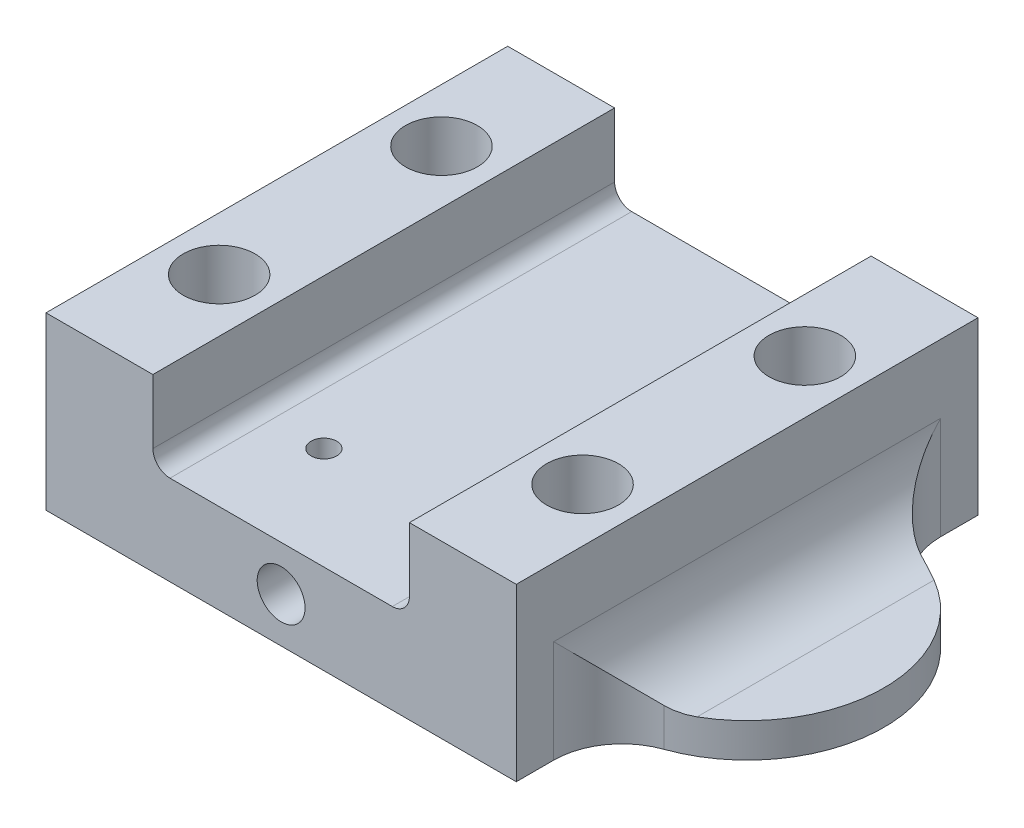
ISO-10303-21;
HEADER;
FILE_DESCRIPTION(('STEP AP214'),'2;1');
FILE_NAME('part.step','',(''),(''),'','','');
FILE_SCHEMA(('AUTOMOTIVE_DESIGN { 1 0 10303 214 1 1 1 1 }'));
ENDSEC;
DATA;
#1=APPLICATION_CONTEXT('core data for automotive mechanical design processes');
#2=APPLICATION_PROTOCOL_DEFINITION('international standard','automotive_design',2000,#1);
#3=PRODUCT_CONTEXT('',#1,'mechanical');
#4=PRODUCT('Part','Part','',(#3));
#5=PRODUCT_RELATED_PRODUCT_CATEGORY('part','',(#4));
#6=PRODUCT_DEFINITION_FORMATION('','',#4);
#7=PRODUCT_DEFINITION_CONTEXT('part definition',#1,'design');
#8=PRODUCT_DEFINITION('design','',#6,#7);
#9=PRODUCT_DEFINITION_SHAPE('','',#8);
#10=(LENGTH_UNIT() NAMED_UNIT(*) SI_UNIT(.MILLI.,.METRE.));
#11=(NAMED_UNIT(*) PLANE_ANGLE_UNIT() SI_UNIT($,.RADIAN.));
#12=(NAMED_UNIT(*) SI_UNIT($,.STERADIAN.) SOLID_ANGLE_UNIT());
#13=UNCERTAINTY_MEASURE_WITH_UNIT(LENGTH_MEASURE(1.E-05),#10,'distance_accuracy_value','');
#14=(GEOMETRIC_REPRESENTATION_CONTEXT(3) GLOBAL_UNCERTAINTY_ASSIGNED_CONTEXT((#13)) GLOBAL_UNIT_ASSIGNED_CONTEXT((#10,
#11,#12)) REPRESENTATION_CONTEXT('',''));
#15=CARTESIAN_POINT('',(0.,0.,0.));
#16=DIRECTION('',(0.,0.,1.));
#17=DIRECTION('',(1.,0.,0.));
#18=AXIS2_PLACEMENT_3D('',#15,#16,#17);
#19=CARTESIAN_POINT('',(0.,-10.,27.));
#20=DIRECTION('',(0.,1.,0.));
#21=DIRECTION('',(0.,0.,1.));
#22=AXIS2_PLACEMENT_3D('',#19,#20,#21);
#23=PLANE('',#22);
#24=CARTESIAN_POINT('',(-3.50000000000001,-10.,21.));
#25=DIRECTION('',(0.,1.,0.));
#26=DIRECTION('',(-1.,0.,0.));
#27=AXIS2_PLACEMENT_3D('',#24,#25,#26);
#28=CIRCLE('',#27,0.750000000000001);
#29=CARTESIAN_POINT('',(-4.25000000000001,-10.,21.));
#30=VERTEX_POINT('',#29);
#31=EDGE_CURVE('E389',#30,#30,#28,.T.);
#32=ORIENTED_EDGE('',*,*,#31,.T.);
#33=EDGE_LOOP('',(#32));
#34=FACE_BOUND('',#33,.T.);
#35=CARTESIAN_POINT('',(3.49999999999999,-10.,6.));
#36=DIRECTION('',(0.,1.,0.));
#37=DIRECTION('',(-1.,0.,0.));
#38=AXIS2_PLACEMENT_3D('',#35,#36,#37);
#39=CIRCLE('',#38,0.749999999999999);
#40=CARTESIAN_POINT('',(2.74999999999999,-10.,6.));
#41=VERTEX_POINT('',#40);
#42=EDGE_CURVE('E405',#41,#41,#39,.T.);
#43=ORIENTED_EDGE('',*,*,#42,.T.);
#44=EDGE_LOOP('',(#43));
#45=FACE_BOUND('',#44,.T.);
#46=CARTESIAN_POINT('',(10.625,-10.,7.));
#47=DIRECTION('',(0.,1.,0.));
#48=DIRECTION('',(0.,0.,1.));
#49=AXIS2_PLACEMENT_3D('',#46,#47,#48);
#50=CIRCLE('',#49,2.1);
#51=CARTESIAN_POINT('',(10.625,-10.,9.1));
#52=VERTEX_POINT('',#51);
#53=EDGE_CURVE('E417',#52,#52,#50,.T.);
#54=ORIENTED_EDGE('',*,*,#53,.T.);
#55=EDGE_LOOP('',(#54));
#56=FACE_BOUND('',#55,.T.);
#57=CARTESIAN_POINT('',(-10.625,-10.,20.));
#58=DIRECTION('',(0.,1.,0.));
#59=DIRECTION('',(0.,0.,1.));
#60=AXIS2_PLACEMENT_3D('',#57,#58,#59);
#61=CIRCLE('',#60,2.1);
#62=CARTESIAN_POINT('',(-10.625,-10.,22.1));
#63=VERTEX_POINT('',#62);
#64=EDGE_CURVE('E441',#63,#63,#61,.T.);
#65=ORIENTED_EDGE('',*,*,#64,.T.);
#66=EDGE_LOOP('',(#65));
#67=FACE_BOUND('',#66,.T.);
#68=DIRECTION('',(1.,0.,0.));
#69=VECTOR('',#68,1.);
#70=CARTESIAN_POINT('',(0.,-10.,0.));
#71=LINE('',#70,#69);
#72=CARTESIAN_POINT('',(-13.75,-10.,0.));
#73=VERTEX_POINT('',#72);
#74=CARTESIAN_POINT('',(13.75,-10.,0.));
#75=VERTEX_POINT('',#74);
#76=EDGE_CURVE('E461',#73,#75,#71,.T.);
#77=ORIENTED_EDGE('',*,*,#76,.T.);
#78=DIRECTION('',(0.,0.,-1.));
#79=VECTOR('',#78,1.);
#80=CARTESIAN_POINT('',(13.75,-10.,27.));
#81=LINE('',#80,#79);
#82=CARTESIAN_POINT('',(13.75,-10.,2.18629150101524));
#83=VERTEX_POINT('',#82);
#84=EDGE_CURVE('E221',#83,#75,#81,.T.);
#85=ORIENTED_EDGE('',*,*,#84,.F.);
#86=CARTESIAN_POINT('',(17.75,-10.,2.18629150101524));
#87=DIRECTION('',(0.,1.,0.));
#88=DIRECTION('',(0.,0.,1.));
#89=AXIS2_PLACEMENT_3D('',#86,#87,#88);
#90=CIRCLE('',#89,4.);
#91=CARTESIAN_POINT('',(16.4166666666667,-10.,5.95752766734349));
#92=VERTEX_POINT('',#91);
#93=EDGE_CURVE('E287',#83,#92,#90,.T.);
#94=ORIENTED_EDGE('',*,*,#93,.T.);
#95=CARTESIAN_POINT('',(13.75,-10.,13.5));
#96=DIRECTION('',(0.,-1.,0.));
#97=DIRECTION('',(0.,0.,-1.));
#98=AXIS2_PLACEMENT_3D('',#95,#96,#97);
#99=CIRCLE('',#98,8.);
#100=CARTESIAN_POINT('',(16.4166666666667,-10.,21.0424723326565));
#101=VERTEX_POINT('',#100);
#102=EDGE_CURVE('E453',#92,#101,#99,.T.);
#103=ORIENTED_EDGE('',*,*,#102,.T.);
#104=CARTESIAN_POINT('',(17.75,-10.,24.8137084989848));
#105=DIRECTION('',(0.,1.,0.));
#106=DIRECTION('',(0.,0.,1.));
#107=AXIS2_PLACEMENT_3D('',#104,#105,#106);
#108=CIRCLE('',#107,4.);
#109=CARTESIAN_POINT('',(13.75,-10.,24.8137084989848));
#110=VERTEX_POINT('',#109);
#111=EDGE_CURVE('E218',#101,#110,#108,.T.);
#112=ORIENTED_EDGE('',*,*,#111,.T.);
#113=CARTESIAN_POINT('',(13.75,-10.,27.));
#114=VERTEX_POINT('',#113);
#115=EDGE_CURVE('E192',#114,#110,#81,.T.);
#116=ORIENTED_EDGE('',*,*,#115,.F.);
#117=DIRECTION('',(1.,0.,0.));
#118=VECTOR('',#117,1.);
#119=CARTESIAN_POINT('',(0.,-10.,27.));
#120=LINE('',#119,#118);
#121=CARTESIAN_POINT('',(-13.75,-10.,27.));
#122=VERTEX_POINT('',#121);
#123=EDGE_CURVE('E201',#122,#114,#120,.T.);
#124=ORIENTED_EDGE('',*,*,#123,.F.);
#125=DIRECTION('',(0.,0.,-1.));
#126=VECTOR('',#125,1.);
#127=CARTESIAN_POINT('',(-13.75,-10.,27.));
#128=LINE('',#127,#126);
#129=CARTESIAN_POINT('',(-13.75,-10.,24.8137084989848));
#130=VERTEX_POINT('',#129);
#131=EDGE_CURVE('E503',#122,#130,#128,.T.);
#132=ORIENTED_EDGE('',*,*,#131,.T.);
#133=CARTESIAN_POINT('',(-17.75,-10.,24.8137084989848));
#134=DIRECTION('',(0.,1.,0.));
#135=DIRECTION('',(0.,0.,1.));
#136=AXIS2_PLACEMENT_3D('',#133,#134,#135);
#137=CIRCLE('',#136,4.);
#138=CARTESIAN_POINT('',(-16.4166666666667,-10.,21.0424723326565));
#139=VERTEX_POINT('',#138);
#140=EDGE_CURVE('E12',#130,#139,#137,.T.);
#141=ORIENTED_EDGE('',*,*,#140,.T.);
#142=CARTESIAN_POINT('',(-13.75,-10.,13.5));
#143=DIRECTION('',(0.,-1.,0.));
#144=DIRECTION('',(0.,0.,1.));
#145=AXIS2_PLACEMENT_3D('',#142,#143,#144);
#146=CIRCLE('',#145,8.00000000000001);
#147=CARTESIAN_POINT('',(-16.4166666666667,-10.,5.95752766734349));
#148=VERTEX_POINT('',#147);
#149=EDGE_CURVE('E445',#139,#148,#146,.T.);
#150=ORIENTED_EDGE('',*,*,#149,.T.);
#151=CARTESIAN_POINT('',(-17.75,-10.,2.18629150101523));
#152=DIRECTION('',(0.,1.,0.));
#153=DIRECTION('',(0.,0.,1.));
#154=AXIS2_PLACEMENT_3D('',#151,#152,#153);
#155=CIRCLE('',#154,4.);
#156=CARTESIAN_POINT('',(-13.75,-10.,2.18629150101523));
#157=VERTEX_POINT('',#156);
#158=EDGE_CURVE('E557',#148,#157,#155,.T.);
#159=ORIENTED_EDGE('',*,*,#158,.T.);
#160=EDGE_CURVE('E479',#157,#73,#128,.T.);
#161=ORIENTED_EDGE('',*,*,#160,.T.);
#162=EDGE_LOOP('',(#77,#85,#94,#103,#112,#116,#124,#132,#141,#150,#159,#161));
#163=FACE_BOUND('',#162,.T.);
#164=CARTESIAN_POINT('',(-10.625,-10.,7.));
#165=DIRECTION('',(0.,1.,0.));
#166=DIRECTION('',(0.,0.,1.));
#167=AXIS2_PLACEMENT_3D('',#164,#165,#166);
#168=CIRCLE('',#167,2.1);
#169=CARTESIAN_POINT('',(-10.625,-10.,9.1));
#170=VERTEX_POINT('',#169);
#171=EDGE_CURVE('E434',#170,#170,#168,.F.);
#172=ORIENTED_EDGE('',*,*,#171,.F.);
#173=EDGE_LOOP('',(#172));
#174=FACE_BOUND('',#173,.T.);
#175=CARTESIAN_POINT('',(10.625,-10.,20.));
#176=DIRECTION('',(0.,1.,0.));
#177=DIRECTION('',(0.,0.,1.));
#178=AXIS2_PLACEMENT_3D('',#175,#176,#177);
#179=CIRCLE('',#178,2.1);
#180=CARTESIAN_POINT('',(10.625,-10.,22.1));
#181=VERTEX_POINT('',#180);
#182=EDGE_CURVE('E425',#181,#181,#179,.F.);
#183=ORIENTED_EDGE('',*,*,#182,.F.);
#184=EDGE_LOOP('',(#183));
#185=FACE_BOUND('',#184,.T.);
#186=ADVANCED_FACE('F47',(#34,#45,#56,#67,#163,#174,#185),#23,.F.);
#187=CARTESIAN_POINT('',(0.,0.,27.));
#188=DIRECTION('',(0.,1.,0.));
#189=DIRECTION('',(0.,0.,1.));
#190=AXIS2_PLACEMENT_3D('',#187,#188,#189);
#191=PLANE('',#190);
#192=DIRECTION('',(1.,0.,0.));
#193=VECTOR('',#192,1.);
#194=CARTESIAN_POINT('',(0.,0.,0.));
#195=LINE('',#194,#193);
#196=CARTESIAN_POINT('',(7.5,0.,0.));
#197=VERTEX_POINT('',#196);
#198=CARTESIAN_POINT('',(13.75,0.,0.));
#199=VERTEX_POINT('',#198);
#200=EDGE_CURVE('E485',#197,#199,#195,.T.);
#201=ORIENTED_EDGE('',*,*,#200,.F.);
#202=DIRECTION('',(0.,0.,-1.));
#203=VECTOR('',#202,1.);
#204=CARTESIAN_POINT('',(7.5,0.,27.));
#205=LINE('',#204,#203);
#206=CARTESIAN_POINT('',(7.5,0.,27.));
#207=VERTEX_POINT('',#206);
#208=EDGE_CURVE('E512',#207,#197,#205,.T.);
#209=ORIENTED_EDGE('',*,*,#208,.F.);
#210=DIRECTION('',(1.,0.,0.));
#211=VECTOR('',#210,1.);
#212=CARTESIAN_POINT('',(0.,0.,27.));
#213=LINE('',#212,#211);
#214=CARTESIAN_POINT('',(13.75,0.,27.));
#215=VERTEX_POINT('',#214);
#216=EDGE_CURVE('E200',#207,#215,#213,.T.);
#217=ORIENTED_EDGE('',*,*,#216,.T.);
#218=DIRECTION('',(0.,0.,-1.));
#219=VECTOR('',#218,1.);
#220=CARTESIAN_POINT('',(13.75,0.,27.));
#221=LINE('',#220,#219);
#222=EDGE_CURVE('E195',#215,#199,#221,.T.);
#223=ORIENTED_EDGE('',*,*,#222,.T.);
#224=EDGE_LOOP('',(#201,#209,#217,#223));
#225=FACE_BOUND('',#224,.T.);
#226=CARTESIAN_POINT('',(10.625,0.,7.));
#227=DIRECTION('',(0.,1.,0.));
#228=DIRECTION('',(0.,0.,1.));
#229=AXIS2_PLACEMENT_3D('',#226,#227,#228);
#230=CIRCLE('',#229,2.1);
#231=CARTESIAN_POINT('',(10.625,0.,9.1));
#232=VERTEX_POINT('',#231);
#233=EDGE_CURVE('E413',#232,#232,#230,.T.);
#234=ORIENTED_EDGE('',*,*,#233,.F.);
#235=EDGE_LOOP('',(#234));
#236=FACE_BOUND('',#235,.T.);
#237=CARTESIAN_POINT('',(10.625,0.,20.));
#238=DIRECTION('',(0.,1.,0.));
#239=DIRECTION('',(0.,0.,1.));
#240=AXIS2_PLACEMENT_3D('',#237,#238,#239);
#241=CIRCLE('',#240,2.1);
#242=CARTESIAN_POINT('',(10.625,0.,22.1));
#243=VERTEX_POINT('',#242);
#244=EDGE_CURVE('E430',#243,#243,#241,.F.);
#245=ORIENTED_EDGE('',*,*,#244,.T.);
#246=EDGE_LOOP('',(#245));
#247=FACE_BOUND('',#246,.T.);
#248=ADVANCED_FACE('F330',(#225,#236,#247),#191,.T.);
#249=CARTESIAN_POINT('',(-13.75,0.,0.));
#250=VERTEX_POINT('',#249);
#251=CARTESIAN_POINT('',(-7.5,0.,0.));
#252=VERTEX_POINT('',#251);
#253=EDGE_CURVE('E490',#250,#252,#195,.T.);
#254=ORIENTED_EDGE('',*,*,#253,.F.);
#255=DIRECTION('',(0.,0.,-1.));
#256=VECTOR('',#255,1.);
#257=CARTESIAN_POINT('',(-13.75,0.,27.));
#258=LINE('',#257,#256);
#259=CARTESIAN_POINT('',(-13.75,0.,27.));
#260=VERTEX_POINT('',#259);
#261=EDGE_CURVE('E506',#260,#250,#258,.T.);
#262=ORIENTED_EDGE('',*,*,#261,.F.);
#263=CARTESIAN_POINT('',(-7.5,0.,27.));
#264=VERTEX_POINT('',#263);
#265=EDGE_CURVE('E467',#260,#264,#213,.T.);
#266=ORIENTED_EDGE('',*,*,#265,.T.);
#267=DIRECTION('',(0.,0.,-1.));
#268=VECTOR('',#267,1.);
#269=CARTESIAN_POINT('',(-7.5,0.,27.));
#270=LINE('',#269,#268);
#271=EDGE_CURVE('E509',#264,#252,#270,.T.);
#272=ORIENTED_EDGE('',*,*,#271,.T.);
#273=EDGE_LOOP('',(#254,#262,#266,#272));
#274=FACE_BOUND('',#273,.T.);
#275=CARTESIAN_POINT('',(-10.625,0.,20.));
#276=DIRECTION('',(0.,1.,0.));
#277=DIRECTION('',(0.,0.,1.));
#278=AXIS2_PLACEMENT_3D('',#275,#276,#277);
#279=CIRCLE('',#278,2.1);
#280=CARTESIAN_POINT('',(-10.625,0.,22.1));
#281=VERTEX_POINT('',#280);
#282=EDGE_CURVE('E429',#281,#281,#279,.T.);
#283=ORIENTED_EDGE('',*,*,#282,.F.);
#284=EDGE_LOOP('',(#283));
#285=FACE_BOUND('',#284,.T.);
#286=CARTESIAN_POINT('',(-10.625,0.,7.));
#287=DIRECTION('',(0.,1.,0.));
#288=DIRECTION('',(0.,0.,1.));
#289=AXIS2_PLACEMENT_3D('',#286,#287,#288);
#290=CIRCLE('',#289,2.1);
#291=CARTESIAN_POINT('',(-10.625,0.,9.1));
#292=VERTEX_POINT('',#291);
#293=EDGE_CURVE('E421',#292,#292,#290,.F.);
#294=ORIENTED_EDGE('',*,*,#293,.T.);
#295=EDGE_LOOP('',(#294));
#296=FACE_BOUND('',#295,.T.);
#297=ADVANCED_FACE('F333',(#274,#285,#296),#191,.T.);
#298=CARTESIAN_POINT('',(13.75,0.,27.));
#299=DIRECTION('',(-1.,0.,0.));
#300=DIRECTION('',(0.,0.,1.));
#301=AXIS2_PLACEMENT_3D('',#298,#299,#300);
#302=PLANE('',#301);
#303=DIRECTION('',(0.,0.,-1.));
#304=VECTOR('',#303,1.);
#305=CARTESIAN_POINT('',(13.75,-4.,5.5));
#306=LINE('',#305,#304);
#307=CARTESIAN_POINT('',(13.75,-4.,24.8137084989848));
#308=VERTEX_POINT('',#307);
#309=CARTESIAN_POINT('',(13.75,-4.,2.18629150101524));
#310=VERTEX_POINT('',#309);
#311=EDGE_CURVE('E255',#308,#310,#306,.T.);
#312=ORIENTED_EDGE('',*,*,#311,.T.);
#313=DIRECTION('',(0.,-1.,0.));
#314=VECTOR('',#313,1.);
#315=CARTESIAN_POINT('',(13.75,0.,2.18629150101524));
#316=LINE('',#315,#314);
#317=EDGE_CURVE('E258',#310,#83,#316,.T.);
#318=ORIENTED_EDGE('',*,*,#317,.T.);
#319=ORIENTED_EDGE('',*,*,#84,.T.);
#320=DIRECTION('',(0.,1.,0.));
#321=VECTOR('',#320,1.);
#322=CARTESIAN_POINT('',(13.75,0.,0.));
#323=LINE('',#322,#321);
#324=EDGE_CURVE('E482',#75,#199,#323,.T.);
#325=ORIENTED_EDGE('',*,*,#324,.T.);
#326=ORIENTED_EDGE('',*,*,#222,.F.);
#327=DIRECTION('',(0.,1.,0.));
#328=VECTOR('',#327,1.);
#329=CARTESIAN_POINT('',(13.75,0.,27.));
#330=LINE('',#329,#328);
#331=EDGE_CURVE('E188',#114,#215,#330,.T.);
#332=ORIENTED_EDGE('',*,*,#331,.F.);
#333=ORIENTED_EDGE('',*,*,#115,.T.);
#334=DIRECTION('',(0.,-1.,0.));
#335=VECTOR('',#334,1.);
#336=CARTESIAN_POINT('',(13.75,0.,24.8137084989848));
#337=LINE('',#336,#335);
#338=EDGE_CURVE('E252',#110,#308,#337,.F.);
#339=ORIENTED_EDGE('',*,*,#338,.T.);
#340=EDGE_LOOP('',(#312,#318,#319,#325,#326,#332,#333,#339));
#341=FACE_BOUND('',#340,.T.);
#342=ADVANCED_FACE('F190',(#341),#302,.F.);
#343=CARTESIAN_POINT('',(7.5,0.,27.));
#344=DIRECTION('',(-1.,0.,0.));
#345=DIRECTION('',(0.,-1.,0.));
#346=AXIS2_PLACEMENT_3D('',#343,#344,#345);
#347=PLANE('',#346);
#348=DIRECTION('',(0.,1.,0.));
#349=VECTOR('',#348,1.);
#350=CARTESIAN_POINT('',(7.5,0.,0.));
#351=LINE('',#350,#349);
#352=CARTESIAN_POINT('',(7.5,-3.75,0.));
#353=VERTEX_POINT('',#352);
#354=EDGE_CURVE('E489',#353,#197,#351,.T.);
#355=ORIENTED_EDGE('',*,*,#354,.F.);
#356=DIRECTION('',(0.,0.,-1.));
#357=VECTOR('',#356,1.);
#358=CARTESIAN_POINT('',(7.5,-3.75,27.));
#359=LINE('',#358,#357);
#360=CARTESIAN_POINT('',(7.5,-3.75,27.));
#361=VERTEX_POINT('',#360);
#362=EDGE_CURVE('E233',#353,#361,#359,.F.);
#363=ORIENTED_EDGE('',*,*,#362,.T.);
#364=DIRECTION('',(0.,1.,0.));
#365=VECTOR('',#364,1.);
#366=CARTESIAN_POINT('',(7.5,0.,27.));
#367=LINE('',#366,#365);
#368=EDGE_CURVE('E466',#361,#207,#367,.T.);
#369=ORIENTED_EDGE('',*,*,#368,.T.);
#370=ORIENTED_EDGE('',*,*,#208,.T.);
#371=EDGE_LOOP('',(#355,#363,#369,#370));
#372=FACE_BOUND('',#371,.T.);
#373=ADVANCED_FACE('F341',(#372),#347,.T.);
#374=CARTESIAN_POINT('',(0.,-4.75,27.));
#375=DIRECTION('',(0.,1.,0.));
#376=DIRECTION('',(-1.,0.,0.));
#377=AXIS2_PLACEMENT_3D('',#374,#375,#376);
#378=PLANE('',#377);
#379=CARTESIAN_POINT('',(-3.5,-4.75,21.));
#380=DIRECTION('',(0.,1.,0.));
#381=DIRECTION('',(-1.,0.,0.));
#382=AXIS2_PLACEMENT_3D('',#379,#380,#381);
#383=CIRCLE('',#382,0.750000000000001);
#384=CARTESIAN_POINT('',(-4.25,-4.75,21.));
#385=VERTEX_POINT('',#384);
#386=EDGE_CURVE('E394',#385,#385,#383,.T.);
#387=ORIENTED_EDGE('',*,*,#386,.F.);
#388=EDGE_LOOP('',(#387));
#389=FACE_BOUND('',#388,.T.);
#390=CARTESIAN_POINT('',(3.5,-4.75,6.));
#391=DIRECTION('',(0.,1.,0.));
#392=DIRECTION('',(-1.,0.,0.));
#393=AXIS2_PLACEMENT_3D('',#390,#391,#392);
#394=CIRCLE('',#393,0.749999999999999);
#395=CARTESIAN_POINT('',(2.75,-4.75,6.));
#396=VERTEX_POINT('',#395);
#397=EDGE_CURVE('E399',#396,#396,#394,.T.);
#398=ORIENTED_EDGE('',*,*,#397,.F.);
#399=EDGE_LOOP('',(#398));
#400=FACE_BOUND('',#399,.T.);
#401=DIRECTION('',(1.,0.,0.));
#402=VECTOR('',#401,1.);
#403=CARTESIAN_POINT('',(0.,-4.75,27.));
#404=LINE('',#403,#402);
#405=CARTESIAN_POINT('',(-6.5,-4.74999999999999,27.));
#406=VERTEX_POINT('',#405);
#407=CARTESIAN_POINT('',(6.5,-4.75,27.));
#408=VERTEX_POINT('',#407);
#409=EDGE_CURVE('E470',#406,#408,#404,.T.);
#410=ORIENTED_EDGE('',*,*,#409,.T.);
#411=DIRECTION('',(0.,0.,-1.));
#412=VECTOR('',#411,1.);
#413=CARTESIAN_POINT('',(6.5,-4.75,0.));
#414=LINE('',#413,#412);
#415=CARTESIAN_POINT('',(6.5,-4.75,0.));
#416=VERTEX_POINT('',#415);
#417=EDGE_CURVE('E225',#408,#416,#414,.T.);
#418=ORIENTED_EDGE('',*,*,#417,.T.);
#419=DIRECTION('',(1.,0.,0.));
#420=VECTOR('',#419,1.);
#421=CARTESIAN_POINT('',(0.,-4.75,0.));
#422=LINE('',#421,#420);
#423=CARTESIAN_POINT('',(-6.5,-4.74999999999999,0.));
#424=VERTEX_POINT('',#423);
#425=EDGE_CURVE('E493',#424,#416,#422,.T.);
#426=ORIENTED_EDGE('',*,*,#425,.F.);
#427=DIRECTION('',(0.,0.,-1.));
#428=VECTOR('',#427,1.);
#429=CARTESIAN_POINT('',(-6.5,-4.74999999999999,27.));
#430=LINE('',#429,#428);
#431=EDGE_CURVE('E220',#424,#406,#430,.F.);
#432=ORIENTED_EDGE('',*,*,#431,.T.);
#433=EDGE_LOOP('',(#410,#418,#426,#432));
#434=FACE_BOUND('',#433,.T.);
#435=ADVANCED_FACE('F337',(#389,#400,#434),#378,.T.);
#436=CARTESIAN_POINT('',(-7.5,0.,27.));
#437=DIRECTION('',(-1.,0.,0.));
#438=DIRECTION('',(0.,-1.,0.));
#439=AXIS2_PLACEMENT_3D('',#436,#437,#438);
#440=PLANE('',#439);
#441=DIRECTION('',(0.,1.,0.));
#442=VECTOR('',#441,1.);
#443=CARTESIAN_POINT('',(-7.5,0.,27.));
#444=LINE('',#443,#442);
#445=CARTESIAN_POINT('',(-7.5,-3.74999999999999,27.));
#446=VERTEX_POINT('',#445);
#447=EDGE_CURVE('E474',#446,#264,#444,.T.);
#448=ORIENTED_EDGE('',*,*,#447,.F.);
#449=DIRECTION('',(0.,0.,-1.));
#450=VECTOR('',#449,1.);
#451=CARTESIAN_POINT('',(-7.5,-3.74999999999999,27.));
#452=LINE('',#451,#450);
#453=CARTESIAN_POINT('',(-7.5,-3.74999999999999,0.));
#454=VERTEX_POINT('',#453);
#455=EDGE_CURVE('E236',#446,#454,#452,.T.);
#456=ORIENTED_EDGE('',*,*,#455,.T.);
#457=DIRECTION('',(0.,1.,0.));
#458=VECTOR('',#457,1.);
#459=CARTESIAN_POINT('',(-7.5,0.,0.));
#460=LINE('',#459,#458);
#461=EDGE_CURVE('E497',#454,#252,#460,.T.);
#462=ORIENTED_EDGE('',*,*,#461,.T.);
#463=ORIENTED_EDGE('',*,*,#271,.F.);
#464=EDGE_LOOP('',(#448,#456,#462,#463));
#465=FACE_BOUND('',#464,.T.);
#466=ADVANCED_FACE('F328',(#465),#440,.F.);
#467=CARTESIAN_POINT('',(-13.75,0.,27.));
#468=DIRECTION('',(-1.,0.,0.));
#469=DIRECTION('',(0.,0.,1.));
#470=AXIS2_PLACEMENT_3D('',#467,#468,#469);
#471=PLANE('',#470);
#472=ORIENTED_EDGE('',*,*,#160,.F.);
#473=DIRECTION('',(0.,1.,0.));
#474=VECTOR('',#473,1.);
#475=CARTESIAN_POINT('',(-13.75,-8.,2.18629150101523));
#476=LINE('',#475,#474);
#477=CARTESIAN_POINT('',(-13.75,-4.,2.18629150101523));
#478=VERTEX_POINT('',#477);
#479=EDGE_CURVE('E281',#157,#478,#476,.T.);
#480=ORIENTED_EDGE('',*,*,#479,.T.);
#481=DIRECTION('',(0.,0.,1.));
#482=VECTOR('',#481,1.);
#483=CARTESIAN_POINT('',(-13.75,-4.,21.5));
#484=LINE('',#483,#482);
#485=CARTESIAN_POINT('',(-13.75,-4.,24.8137084989848));
#486=VERTEX_POINT('',#485);
#487=EDGE_CURVE('E278',#478,#486,#484,.T.);
#488=ORIENTED_EDGE('',*,*,#487,.T.);
#489=DIRECTION('',(0.,1.,0.));
#490=VECTOR('',#489,1.);
#491=CARTESIAN_POINT('',(-13.75,-10.,24.8137084989848));
#492=LINE('',#491,#490);
#493=EDGE_CURVE('E275',#486,#130,#492,.F.);
#494=ORIENTED_EDGE('',*,*,#493,.T.);
#495=ORIENTED_EDGE('',*,*,#131,.F.);
#496=DIRECTION('',(0.,1.,0.));
#497=VECTOR('',#496,1.);
#498=CARTESIAN_POINT('',(-13.75,0.,27.));
#499=LINE('',#498,#497);
#500=EDGE_CURVE('E208',#122,#260,#499,.T.);
#501=ORIENTED_EDGE('',*,*,#500,.T.);
#502=ORIENTED_EDGE('',*,*,#261,.T.);
#503=DIRECTION('',(0.,1.,0.));
#504=VECTOR('',#503,1.);
#505=CARTESIAN_POINT('',(-13.75,0.,0.));
#506=LINE('',#505,#504);
#507=EDGE_CURVE('E212',#73,#250,#506,.T.);
#508=ORIENTED_EDGE('',*,*,#507,.F.);
#509=EDGE_LOOP('',(#472,#480,#488,#494,#495,#501,#502,#508));
#510=FACE_BOUND('',#509,.T.);
#511=ADVANCED_FACE('F321',(#510),#471,.T.);
#512=CARTESIAN_POINT('',(0.,0.,27.));
#513=DIRECTION('',(0.,0.,1.));
#514=DIRECTION('',(1.,0.,0.));
#515=AXIS2_PLACEMENT_3D('',#512,#513,#514);
#516=PLANE('',#515);
#517=CARTESIAN_POINT('',(0.,-7.375,27.));
#518=DIRECTION('',(0.,0.,1.));
#519=DIRECTION('',(1.,0.,0.));
#520=AXIS2_PLACEMENT_3D('',#517,#518,#519);
#521=CIRCLE('',#520,1.4);
#522=CARTESIAN_POINT('',(1.4,-7.375,27.));
#523=VERTEX_POINT('',#522);
#524=EDGE_CURVE('E383',#523,#523,#521,.T.);
#525=ORIENTED_EDGE('',*,*,#524,.F.);
#526=EDGE_LOOP('',(#525));
#527=FACE_BOUND('',#526,.T.);
#528=ORIENTED_EDGE('',*,*,#123,.T.);
#529=ORIENTED_EDGE('',*,*,#331,.T.);
#530=ORIENTED_EDGE('',*,*,#216,.F.);
#531=ORIENTED_EDGE('',*,*,#368,.F.);
#532=CARTESIAN_POINT('',(6.5,-3.75,27.));
#533=DIRECTION('',(0.,0.,1.));
#534=DIRECTION('',(1.,0.,0.));
#535=AXIS2_PLACEMENT_3D('',#532,#533,#534);
#536=CIRCLE('',#535,1.);
#537=EDGE_CURVE('E243',#361,#408,#536,.F.);
#538=ORIENTED_EDGE('',*,*,#537,.T.);
#539=ORIENTED_EDGE('',*,*,#409,.F.);
#540=CARTESIAN_POINT('',(-6.5,-3.74999999999999,27.));
#541=DIRECTION('',(0.,0.,1.));
#542=DIRECTION('',(1.,0.,0.));
#543=AXIS2_PLACEMENT_3D('',#540,#541,#542);
#544=CIRCLE('',#543,1.);
#545=EDGE_CURVE('E249',#406,#446,#544,.F.);
#546=ORIENTED_EDGE('',*,*,#545,.T.);
#547=ORIENTED_EDGE('',*,*,#447,.T.);
#548=ORIENTED_EDGE('',*,*,#265,.F.);
#549=ORIENTED_EDGE('',*,*,#500,.F.);
#550=EDGE_LOOP('',(#528,#529,#530,#531,#538,#539,#546,#547,#548,#549));
#551=FACE_BOUND('',#550,.T.);
#552=ADVANCED_FACE('F205',(#527,#551),#516,.T.);
#553=CARTESIAN_POINT('',(0.,0.,0.));
#554=DIRECTION('',(0.,0.,1.));
#555=DIRECTION('',(1.,0.,0.));
#556=AXIS2_PLACEMENT_3D('',#553,#554,#555);
#557=PLANE('',#556);
#558=CARTESIAN_POINT('',(0.,-7.375,0.));
#559=DIRECTION('',(0.,0.,1.));
#560=DIRECTION('',(1.,0.,0.));
#561=AXIS2_PLACEMENT_3D('',#558,#559,#560);
#562=CIRCLE('',#561,1.4);
#563=CARTESIAN_POINT('',(1.4,-7.375,0.));
#564=VERTEX_POINT('',#563);
#565=EDGE_CURVE('E409',#564,#564,#562,.T.);
#566=ORIENTED_EDGE('',*,*,#565,.T.);
#567=EDGE_LOOP('',(#566));
#568=FACE_BOUND('',#567,.T.);
#569=ORIENTED_EDGE('',*,*,#76,.F.);
#570=ORIENTED_EDGE('',*,*,#507,.T.);
#571=ORIENTED_EDGE('',*,*,#253,.T.);
#572=ORIENTED_EDGE('',*,*,#461,.F.);
#573=CARTESIAN_POINT('',(-6.5,-3.74999999999999,0.));
#574=DIRECTION('',(0.,0.,1.));
#575=DIRECTION('',(1.,0.,0.));
#576=AXIS2_PLACEMENT_3D('',#573,#574,#575);
#577=CIRCLE('',#576,1.);
#578=EDGE_CURVE('E246',#454,#424,#577,.T.);
#579=ORIENTED_EDGE('',*,*,#578,.T.);
#580=ORIENTED_EDGE('',*,*,#425,.T.);
#581=CARTESIAN_POINT('',(6.5,-3.75,0.));
#582=DIRECTION('',(0.,0.,1.));
#583=DIRECTION('',(1.,0.,0.));
#584=AXIS2_PLACEMENT_3D('',#581,#582,#583);
#585=CIRCLE('',#584,1.);
#586=EDGE_CURVE('E240',#416,#353,#585,.T.);
#587=ORIENTED_EDGE('',*,*,#586,.T.);
#588=ORIENTED_EDGE('',*,*,#354,.T.);
#589=ORIENTED_EDGE('',*,*,#200,.T.);
#590=ORIENTED_EDGE('',*,*,#324,.F.);
#591=EDGE_LOOP('',(#569,#570,#571,#572,#579,#580,#587,#588,#589,#590));
#592=FACE_BOUND('',#591,.T.);
#593=ADVANCED_FACE('F315',(#568,#592),#557,.F.);
#594=CARTESIAN_POINT('',(13.75,-8.,13.5));
#595=DIRECTION('',(0.,-1.,0.));
#596=DIRECTION('',(0.,0.,-1.));
#597=AXIS2_PLACEMENT_3D('',#594,#595,#596);
#598=CYLINDRICAL_SURFACE('',#597,8.);
#599=ORIENTED_EDGE('',*,*,#102,.F.);
#600=DIRECTION('',(0.,-1.,0.));
#601=VECTOR('',#600,1.);
#602=CARTESIAN_POINT('',(16.4166666666667,-8.,5.95752766734349));
#603=LINE('',#602,#601);
#604=CARTESIAN_POINT('',(16.4166666666667,-7.77123616632826,5.95752766734349));
#605=VERTEX_POINT('',#604);
#606=EDGE_CURVE('E265',#92,#605,#603,.F.);
#607=ORIENTED_EDGE('',*,*,#606,.T.);
#608=CARTESIAN_POINT('',(16.4166666666667,-7.77123616632826,5.95752766734349));
#609=CARTESIAN_POINT('',(16.5285527431463,-7.81082279716772,5.99705172041315));
#610=CARTESIAN_POINT('',(16.6411905171594,-7.84501680965349,6.0397086216362));
#611=CARTESIAN_POINT('',(16.8657378237197,-7.9027355967948,6.13069882925254));
#612=CARTESIAN_POINT('',(16.9776454220778,-7.92634847167755,6.17898087897053));
#613=CARTESIAN_POINT('',(17.2004241498522,-7.9636768729517,6.28130155881317));
#614=CARTESIAN_POINT('',(17.3112954533207,-7.97739409197361,6.33533920264032));
#615=CARTESIAN_POINT('',(17.5319670707368,-7.99560391654365,6.44929944656121));
#616=CARTESIAN_POINT('',(17.641750092135,-8.0000165512971,6.50926846391736));
#617=CARTESIAN_POINT('',(17.75,-8.,6.57179676972449));
#618=B_SPLINE_CURVE_WITH_KNOTS('',3,(#608,#609,#610,#611,#612,#613,#614,#615,#616,#617),
.UNSPECIFIED.,.F.,.F.,(4,2,2,2,4),(0.,0.375054797245302,0.746926007314859,1.11873359452753,
1.49372397234061),.UNSPECIFIED.);
#619=CARTESIAN_POINT('',(17.75,-8.,6.57179676972449));
#620=VERTEX_POINT('',#619);
#621=EDGE_CURVE('E290',#605,#620,#618,.T.);
#622=ORIENTED_EDGE('',*,*,#621,.T.);
#623=CARTESIAN_POINT('',(13.75,-8.,13.5));
#624=DIRECTION('',(0.,-1.,0.));
#625=DIRECTION('',(0.,0.,-1.));
#626=AXIS2_PLACEMENT_3D('',#623,#624,#625);
#627=CIRCLE('',#626,8.);
#628=CARTESIAN_POINT('',(17.75,-8.,20.4282032302755));
#629=VERTEX_POINT('',#628);
#630=EDGE_CURVE('E457',#620,#629,#627,.T.);
#631=ORIENTED_EDGE('',*,*,#630,.T.);
#632=CARTESIAN_POINT('',(17.75,-8.,20.4282032302755));
#633=CARTESIAN_POINT('',(17.641750092135,-8.0000165512971,20.4907315360826));
#634=CARTESIAN_POINT('',(17.5319670707368,-7.99560391654365,20.5507005534388));
#635=CARTESIAN_POINT('',(17.3112954533206,-7.97739409197361,20.6646607973597));
#636=CARTESIAN_POINT('',(17.2004241498522,-7.9636768729517,20.7186984411868));
#637=CARTESIAN_POINT('',(16.9776454220778,-7.92634847167755,20.8210191210295));
#638=CARTESIAN_POINT('',(16.8657378237197,-7.9027355967948,20.8693011707475));
#639=CARTESIAN_POINT('',(16.6411905171594,-7.84501680965349,20.9602913783638));
#640=CARTESIAN_POINT('',(16.5285527431463,-7.81082279716772,21.0029482795868));
#641=CARTESIAN_POINT('',(16.4166666666667,-7.77123616632826,21.0424723326565));
#642=B_SPLINE_CURVE_WITH_KNOTS('',3,(#632,#633,#634,#635,#636,#637,#638,#639,#640,#641),
.UNSPECIFIED.,.F.,.F.,(4,2,2,2,4),(0.,0.374990377813087,0.74679796502576,1.11866917509532,
1.49372397234062),.UNSPECIFIED.);
#643=CARTESIAN_POINT('',(16.4166666666667,-7.77123616632826,21.0424723326565));
#644=VERTEX_POINT('',#643);
#645=EDGE_CURVE('E299',#629,#644,#642,.T.);
#646=ORIENTED_EDGE('',*,*,#645,.T.);
#647=DIRECTION('',(0.,-1.,0.));
#648=VECTOR('',#647,1.);
#649=CARTESIAN_POINT('',(16.4166666666667,-8.,21.0424723326565));
#650=LINE('',#649,#648);
#651=EDGE_CURVE('E262',#644,#101,#650,.T.);
#652=ORIENTED_EDGE('',*,*,#651,.T.);
#653=EDGE_LOOP('',(#599,#607,#622,#631,#646,#652));
#654=FACE_BOUND('',#653,.T.);
#655=ADVANCED_FACE('F309',(#654),#598,.T.);
#656=CARTESIAN_POINT('',(13.75,-8.,13.5));
#657=DIRECTION('',(0.,-1.,0.));
#658=DIRECTION('',(0.,0.,-1.));
#659=AXIS2_PLACEMENT_3D('',#656,#657,#658);
#660=PLANE('',#659);
#661=ORIENTED_EDGE('',*,*,#630,.F.);
#662=DIRECTION('',(0.,0.,-1.));
#663=VECTOR('',#662,1.);
#664=CARTESIAN_POINT('',(17.75,-8.,21.5));
#665=LINE('',#664,#663);
#666=EDGE_CURVE('E268',#620,#629,#665,.F.);
#667=ORIENTED_EDGE('',*,*,#666,.T.);
#668=EDGE_LOOP('',(#661,#667));
#669=FACE_BOUND('',#668,.T.);
#670=ADVANCED_FACE('F314',(#669),#660,.F.);
#671=CARTESIAN_POINT('',(-13.75,-8.,13.5));
#672=DIRECTION('',(0.,-1.,0.));
#673=DIRECTION('',(0.,0.,-1.));
#674=AXIS2_PLACEMENT_3D('',#671,#672,#673);
#675=CYLINDRICAL_SURFACE('',#674,8.00000000000001);
#676=CARTESIAN_POINT('',(-13.75,-8.,13.5));
#677=DIRECTION('',(0.,-1.,0.));
#678=DIRECTION('',(0.,0.,1.));
#679=AXIS2_PLACEMENT_3D('',#676,#677,#678);
#680=CIRCLE('',#679,8.00000000000001);
#681=CARTESIAN_POINT('',(-17.75,-8.,20.4282032302755));
#682=VERTEX_POINT('',#681);
#683=CARTESIAN_POINT('',(-17.75,-8.,6.57179676972448));
#684=VERTEX_POINT('',#683);
#685=EDGE_CURVE('E449',#682,#684,#680,.T.);
#686=ORIENTED_EDGE('',*,*,#685,.T.);
#687=CARTESIAN_POINT('',(-17.75,-8.,6.57179676972448));
#688=CARTESIAN_POINT('',(-17.641750092135,-8.0000165512971,6.50926846391736));
#689=CARTESIAN_POINT('',(-17.5319670707368,-7.99560391654365,6.44929944656121));
#690=CARTESIAN_POINT('',(-17.3112954533207,-7.97739409197361,6.33533920264032));
#691=CARTESIAN_POINT('',(-17.2004241498522,-7.9636768729517,6.28130155881317));
#692=CARTESIAN_POINT('',(-16.9776454220778,-7.92634847167755,6.17898087897052));
#693=CARTESIAN_POINT('',(-16.8657378237197,-7.9027355967948,6.13069882925253));
#694=CARTESIAN_POINT('',(-16.6411905171594,-7.84501680965349,6.03970862163619));
#695=CARTESIAN_POINT('',(-16.5285527431463,-7.81082279716772,5.99705172041315));
#696=CARTESIAN_POINT('',(-16.4166666666667,-7.77123616632826,5.95752766734349));
#697=B_SPLINE_CURVE_WITH_KNOTS('',3,(#687,#688,#689,#690,#691,#692,#693,#694,#695,#696),
.UNSPECIFIED.,.F.,.F.,(4,2,2,2,4),(0.,0.374990377813085,0.746797965025761,1.11866917509531,
1.49372397234062),.UNSPECIFIED.);
#698=CARTESIAN_POINT('',(-16.4166666666667,-7.77123616632826,5.95752766734349));
#699=VERTEX_POINT('',#698);
#700=EDGE_CURVE('E57',#684,#699,#697,.T.);
#701=ORIENTED_EDGE('',*,*,#700,.T.);
#702=DIRECTION('',(0.,-1.,0.));
#703=VECTOR('',#702,1.);
#704=CARTESIAN_POINT('',(-16.4166666666667,-8.,5.95752766734349));
#705=LINE('',#704,#703);
#706=EDGE_CURVE('E73',#699,#148,#705,.T.);
#707=ORIENTED_EDGE('',*,*,#706,.T.);
#708=ORIENTED_EDGE('',*,*,#149,.F.);
#709=DIRECTION('',(0.,-1.,0.));
#710=VECTOR('',#709,1.);
#711=CARTESIAN_POINT('',(-16.4166666666667,-8.,21.0424723326565));
#712=LINE('',#711,#710);
#713=CARTESIAN_POINT('',(-16.4166666666667,-7.77123616632826,21.0424723326565));
#714=VERTEX_POINT('',#713);
#715=EDGE_CURVE('E65',#139,#714,#712,.F.);
#716=ORIENTED_EDGE('',*,*,#715,.T.);
#717=CARTESIAN_POINT('',(-16.4166666666667,-7.77123616632826,21.0424723326565));
#718=CARTESIAN_POINT('',(-16.5285527431463,-7.81082279716772,21.0029482795869));
#719=CARTESIAN_POINT('',(-16.6411905171594,-7.84501680965349,20.9602913783638));
#720=CARTESIAN_POINT('',(-16.8657378237197,-7.9027355967948,20.8693011707475));
#721=CARTESIAN_POINT('',(-16.9776454220778,-7.92634847167755,20.8210191210295));
#722=CARTESIAN_POINT('',(-17.2004241498522,-7.9636768729517,20.7186984411868));
#723=CARTESIAN_POINT('',(-17.3112954533207,-7.97739409197361,20.6646607973597));
#724=CARTESIAN_POINT('',(-17.5319670707368,-7.99560391654365,20.5507005534388));
#725=CARTESIAN_POINT('',(-17.641750092135,-8.0000165512971,20.4907315360826));
#726=CARTESIAN_POINT('',(-17.75,-8.,20.4282032302755));
#727=B_SPLINE_CURVE_WITH_KNOTS('',3,(#717,#718,#719,#720,#721,#722,#723,#724,#725,#726),
.UNSPECIFIED.,.F.,.F.,(4,2,2,2,4),(0.,0.375054797245305,0.746926007314859,1.11873359452754,
1.49372397234062),.UNSPECIFIED.);
#728=EDGE_CURVE('E553',#714,#682,#727,.T.);
#729=ORIENTED_EDGE('',*,*,#728,.T.);
#730=EDGE_LOOP('',(#686,#701,#707,#708,#716,#729));
#731=FACE_BOUND('',#730,.T.);
#732=ADVANCED_FACE('F572',(#731),#675,.T.);
#733=CARTESIAN_POINT('',(-13.75,-8.,13.5));
#734=DIRECTION('',(0.,1.,0.));
#735=DIRECTION('',(0.,0.,1.));
#736=AXIS2_PLACEMENT_3D('',#733,#734,#735);
#737=PLANE('',#736);
#738=ORIENTED_EDGE('',*,*,#685,.F.);
#739=DIRECTION('',(0.,0.,1.));
#740=VECTOR('',#739,1.);
#741=CARTESIAN_POINT('',(-17.75,-8.,5.49999999999998));
#742=LINE('',#741,#740);
#743=EDGE_CURVE('E284',#682,#684,#742,.F.);
#744=ORIENTED_EDGE('',*,*,#743,.T.);
#745=EDGE_LOOP('',(#738,#744));
#746=FACE_BOUND('',#745,.T.);
#747=ADVANCED_FACE('F576',(#746),#737,.T.);
#748=CARTESIAN_POINT('',(-10.625,-10.,20.));
#749=DIRECTION('',(0.,1.,0.));
#750=DIRECTION('',(0.,0.,1.));
#751=AXIS2_PLACEMENT_3D('',#748,#749,#750);
#752=CYLINDRICAL_SURFACE('',#751,2.1);
#753=ORIENTED_EDGE('',*,*,#64,.F.);
#754=EDGE_LOOP('',(#753));
#755=FACE_BOUND('',#754,.T.);
#756=ORIENTED_EDGE('',*,*,#282,.T.);
#757=EDGE_LOOP('',(#756));
#758=FACE_BOUND('',#757,.T.);
#759=ADVANCED_FACE('F580',(#755,#758),#752,.F.);
#760=CARTESIAN_POINT('',(-10.625,-10.,7.));
#761=DIRECTION('',(0.,1.,0.));
#762=DIRECTION('',(0.,0.,1.));
#763=AXIS2_PLACEMENT_3D('',#760,#761,#762);
#764=CYLINDRICAL_SURFACE('',#763,2.1);
#765=ORIENTED_EDGE('',*,*,#171,.T.);
#766=EDGE_LOOP('',(#765));
#767=FACE_BOUND('',#766,.T.);
#768=ORIENTED_EDGE('',*,*,#293,.F.);
#769=EDGE_LOOP('',(#768));
#770=FACE_BOUND('',#769,.T.);
#771=ADVANCED_FACE('F584',(#767,#770),#764,.F.);
#772=CARTESIAN_POINT('',(10.625,-10.,7.));
#773=DIRECTION('',(0.,1.,0.));
#774=DIRECTION('',(0.,0.,1.));
#775=AXIS2_PLACEMENT_3D('',#772,#773,#774);
#776=CYLINDRICAL_SURFACE('',#775,2.1);
#777=ORIENTED_EDGE('',*,*,#53,.F.);
#778=EDGE_LOOP('',(#777));
#779=FACE_BOUND('',#778,.T.);
#780=ORIENTED_EDGE('',*,*,#233,.T.);
#781=EDGE_LOOP('',(#780));
#782=FACE_BOUND('',#781,.T.);
#783=ADVANCED_FACE('F588',(#779,#782),#776,.F.);
#784=CARTESIAN_POINT('',(10.625,-10.,20.));
#785=DIRECTION('',(0.,1.,0.));
#786=DIRECTION('',(0.,0.,1.));
#787=AXIS2_PLACEMENT_3D('',#784,#785,#786);
#788=CYLINDRICAL_SURFACE('',#787,2.1);
#789=ORIENTED_EDGE('',*,*,#182,.T.);
#790=EDGE_LOOP('',(#789));
#791=FACE_BOUND('',#790,.T.);
#792=ORIENTED_EDGE('',*,*,#244,.F.);
#793=EDGE_LOOP('',(#792));
#794=FACE_BOUND('',#793,.T.);
#795=ADVANCED_FACE('F590',(#791,#794),#788,.F.);
#796=CARTESIAN_POINT('',(0.,-7.375,0.));
#797=DIRECTION('',(0.,0.,1.));
#798=DIRECTION('',(1.,0.,0.));
#799=AXIS2_PLACEMENT_3D('',#796,#797,#798);
#800=CYLINDRICAL_SURFACE('',#799,1.4);
#801=ORIENTED_EDGE('',*,*,#565,.F.);
#802=EDGE_LOOP('',(#801));
#803=FACE_BOUND('',#802,.T.);
#804=ORIENTED_EDGE('',*,*,#524,.T.);
#805=EDGE_LOOP('',(#804));
#806=FACE_BOUND('',#805,.T.);
#807=ADVANCED_FACE('F355',(#803,#806),#800,.F.);
#808=CARTESIAN_POINT('',(6.5,-3.75,27.));
#809=DIRECTION('',(0.,0.,1.));
#810=DIRECTION('',(1.,0.,0.));
#811=AXIS2_PLACEMENT_3D('',#808,#809,#810);
#812=CYLINDRICAL_SURFACE('',#811,1.);
#813=ORIENTED_EDGE('',*,*,#537,.F.);
#814=ORIENTED_EDGE('',*,*,#362,.F.);
#815=ORIENTED_EDGE('',*,*,#586,.F.);
#816=ORIENTED_EDGE('',*,*,#417,.F.);
#817=EDGE_LOOP('',(#813,#814,#815,#816));
#818=FACE_BOUND('',#817,.T.);
#819=ADVANCED_FACE('F351',(#818),#812,.F.);
#820=CARTESIAN_POINT('',(-6.5,-3.74999999999999,27.));
#821=DIRECTION('',(0.,0.,-1.));
#822=DIRECTION('',(-1.,0.,0.));
#823=AXIS2_PLACEMENT_3D('',#820,#821,#822);
#824=CYLINDRICAL_SURFACE('',#823,1.);
#825=ORIENTED_EDGE('',*,*,#545,.F.);
#826=ORIENTED_EDGE('',*,*,#431,.F.);
#827=ORIENTED_EDGE('',*,*,#578,.F.);
#828=ORIENTED_EDGE('',*,*,#455,.F.);
#829=EDGE_LOOP('',(#825,#826,#827,#828));
#830=FACE_BOUND('',#829,.T.);
#831=ADVANCED_FACE('F354',(#830),#824,.F.);
#832=CARTESIAN_POINT('',(17.75,-8.,24.8137084989848));
#833=DIRECTION('',(0.,-1.,0.));
#834=DIRECTION('',(0.,0.,-1.));
#835=AXIS2_PLACEMENT_3D('',#832,#833,#834);
#836=CYLINDRICAL_SURFACE('',#835,4.);
#837=ORIENTED_EDGE('',*,*,#651,.F.);
#838=CARTESIAN_POINT('',(17.75,-4.,24.8137084989848));
#839=DIRECTION('',(0.,-0.707106781186547,0.707106781186547));
#840=DIRECTION('',(0.,-0.707106781186547,-0.707106781186547));
#841=AXIS2_PLACEMENT_3D('',#838,#839,#840);
#842=ELLIPSE('',#841,5.65685424949238,4.);
#843=EDGE_CURVE('E378',#308,#644,#842,.T.);
#844=ORIENTED_EDGE('',*,*,#843,.F.);
#845=ORIENTED_EDGE('',*,*,#338,.F.);
#846=ORIENTED_EDGE('',*,*,#111,.F.);
#847=EDGE_LOOP('',(#837,#844,#845,#846));
#848=FACE_BOUND('',#847,.T.);
#849=ADVANCED_FACE('F358',(#848),#836,.F.);
#850=CARTESIAN_POINT('',(17.75,-4.,27.));
#851=DIRECTION('',(0.,0.,1.));
#852=DIRECTION('',(1.,0.,0.));
#853=AXIS2_PLACEMENT_3D('',#850,#851,#852);
#854=CYLINDRICAL_SURFACE('',#853,4.);
#855=ORIENTED_EDGE('',*,*,#666,.F.);
#856=ORIENTED_EDGE('',*,*,#621,.F.);
#857=CARTESIAN_POINT('',(17.75,-4.,2.18629150101524));
#858=DIRECTION('',(0.,0.707106781186547,0.707106781186547));
#859=DIRECTION('',(0.,-0.707106781186547,0.707106781186547));
#860=AXIS2_PLACEMENT_3D('',#857,#858,#859);
#861=ELLIPSE('',#860,5.65685424949238,4.);
#862=EDGE_CURVE('E374',#310,#605,#861,.T.);
#863=ORIENTED_EDGE('',*,*,#862,.F.);
#864=ORIENTED_EDGE('',*,*,#311,.F.);
#865=ORIENTED_EDGE('',*,*,#843,.T.);
#866=ORIENTED_EDGE('',*,*,#645,.F.);
#867=EDGE_LOOP('',(#855,#856,#863,#864,#865,#866));
#868=FACE_BOUND('',#867,.T.);
#869=ADVANCED_FACE('F305',(#868),#854,.F.);
#870=CARTESIAN_POINT('',(17.75,-8.,2.18629150101524));
#871=DIRECTION('',(0.,-1.,0.));
#872=DIRECTION('',(0.,0.,-1.));
#873=AXIS2_PLACEMENT_3D('',#870,#871,#872);
#874=CYLINDRICAL_SURFACE('',#873,4.);
#875=ORIENTED_EDGE('',*,*,#862,.T.);
#876=ORIENTED_EDGE('',*,*,#606,.F.);
#877=ORIENTED_EDGE('',*,*,#93,.F.);
#878=ORIENTED_EDGE('',*,*,#317,.F.);
#879=EDGE_LOOP('',(#875,#876,#877,#878));
#880=FACE_BOUND('',#879,.T.);
#881=ADVANCED_FACE('F360',(#880),#874,.F.);
#882=CARTESIAN_POINT('',(-17.75,-8.,24.8137084989848));
#883=DIRECTION('',(0.,-1.,0.));
#884=DIRECTION('',(0.,0.,-1.));
#885=AXIS2_PLACEMENT_3D('',#882,#883,#884);
#886=CYLINDRICAL_SURFACE('',#885,4.);
#887=ORIENTED_EDGE('',*,*,#140,.F.);
#888=ORIENTED_EDGE('',*,*,#493,.F.);
#889=CARTESIAN_POINT('',(-17.75,-4.,24.8137084989848));
#890=DIRECTION('',(0.,-0.707106781186547,0.707106781186547));
#891=DIRECTION('',(0.,-0.707106781186547,-0.707106781186547));
#892=AXIS2_PLACEMENT_3D('',#889,#890,#891);
#893=ELLIPSE('',#892,5.65685424949238,4.);
#894=EDGE_CURVE('E51',#714,#486,#893,.T.);
#895=ORIENTED_EDGE('',*,*,#894,.F.);
#896=ORIENTED_EDGE('',*,*,#715,.F.);
#897=EDGE_LOOP('',(#887,#888,#895,#896));
#898=FACE_BOUND('',#897,.T.);
#899=ADVANCED_FACE('F49',(#898),#886,.F.);
#900=CARTESIAN_POINT('',(-17.75,-4.,27.));
#901=DIRECTION('',(0.,0.,-1.));
#902=DIRECTION('',(-1.,0.,0.));
#903=AXIS2_PLACEMENT_3D('',#900,#901,#902);
#904=CYLINDRICAL_SURFACE('',#903,4.);
#905=ORIENTED_EDGE('',*,*,#894,.T.);
#906=ORIENTED_EDGE('',*,*,#487,.F.);
#907=CARTESIAN_POINT('',(-17.75,-4.,2.18629150101523));
#908=DIRECTION('',(0.,-0.707106781186547,-0.707106781186547));
#909=DIRECTION('',(0.,0.707106781186547,-0.707106781186547));
#910=AXIS2_PLACEMENT_3D('',#907,#908,#909);
#911=ELLIPSE('',#910,5.65685424949238,4.);
#912=EDGE_CURVE('E386',#699,#478,#911,.F.);
#913=ORIENTED_EDGE('',*,*,#912,.F.);
#914=ORIENTED_EDGE('',*,*,#700,.F.);
#915=ORIENTED_EDGE('',*,*,#743,.F.);
#916=ORIENTED_EDGE('',*,*,#728,.F.);
#917=EDGE_LOOP('',(#905,#906,#913,#914,#915,#916));
#918=FACE_BOUND('',#917,.T.);
#919=ADVANCED_FACE('F367',(#918),#904,.F.);
#920=CARTESIAN_POINT('',(-17.75,-8.,2.18629150101523));
#921=DIRECTION('',(0.,-1.,0.));
#922=DIRECTION('',(0.,0.,-1.));
#923=AXIS2_PLACEMENT_3D('',#920,#921,#922);
#924=CYLINDRICAL_SURFACE('',#923,4.);
#925=ORIENTED_EDGE('',*,*,#912,.T.);
#926=ORIENTED_EDGE('',*,*,#479,.F.);
#927=ORIENTED_EDGE('',*,*,#158,.F.);
#928=ORIENTED_EDGE('',*,*,#706,.F.);
#929=EDGE_LOOP('',(#925,#926,#927,#928));
#930=FACE_BOUND('',#929,.T.);
#931=ADVANCED_FACE('F604',(#930),#924,.F.);
#932=CARTESIAN_POINT('',(3.49999999999999,-10.,6.));
#933=DIRECTION('',(0.,1.,0.));
#934=DIRECTION('',(-1.,0.,0.));
#935=AXIS2_PLACEMENT_3D('',#932,#933,#934);
#936=CYLINDRICAL_SURFACE('',#935,0.749999999999999);
#937=ORIENTED_EDGE('',*,*,#42,.F.);
#938=EDGE_LOOP('',(#937));
#939=FACE_BOUND('',#938,.T.);
#940=ORIENTED_EDGE('',*,*,#397,.T.);
#941=EDGE_LOOP('',(#940));
#942=FACE_BOUND('',#941,.T.);
#943=ADVANCED_FACE('F600',(#939,#942),#936,.F.);
#944=CARTESIAN_POINT('',(-3.50000000000001,-10.,21.));
#945=DIRECTION('',(0.,1.,0.));
#946=DIRECTION('',(-1.,0.,0.));
#947=AXIS2_PLACEMENT_3D('',#944,#945,#946);
#948=CYLINDRICAL_SURFACE('',#947,0.750000000000001);
#949=ORIENTED_EDGE('',*,*,#31,.F.);
#950=EDGE_LOOP('',(#949));
#951=FACE_BOUND('',#950,.T.);
#952=ORIENTED_EDGE('',*,*,#386,.T.);
#953=EDGE_LOOP('',(#952));
#954=FACE_BOUND('',#953,.T.);
#955=ADVANCED_FACE('F603',(#951,#954),#948,.F.);
#956=CLOSED_SHELL('',(#186,#248,#297,#342,#373,#435,#466,#511,#552,#593,#655,#670,#732,#747,
#759,#771,#783,#795,#807,#819,#831,#849,#869,#881,#899,#919,#931,#943,#955));
#957=MANIFOLD_SOLID_BREP('B2',#956);
#958=ADVANCED_BREP_SHAPE_REPRESENTATION('',(#18,#957),#14);
#959=SHAPE_DEFINITION_REPRESENTATION(#9,#958);
ENDSEC;
END-ISO-10303-21;
